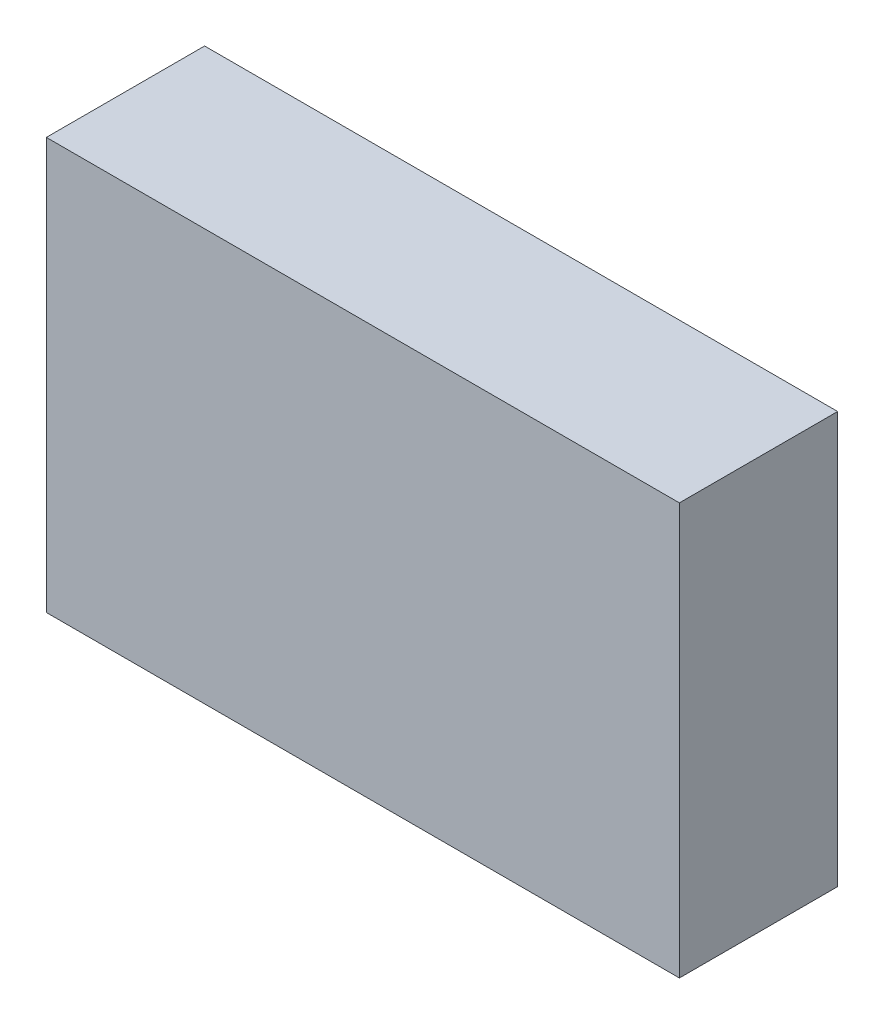
ISO-10303-21;
HEADER;
FILE_DESCRIPTION(('STEP AP214'),'2;1');
FILE_NAME('part.step','',(''),(''),'','','');
FILE_SCHEMA(('AUTOMOTIVE_DESIGN { 1 0 10303 214 1 1 1 1 }'));
ENDSEC;
DATA;
#1=APPLICATION_CONTEXT('core data for automotive mechanical design processes');
#2=APPLICATION_PROTOCOL_DEFINITION('international standard','automotive_design',2000,#1);
#3=PRODUCT_CONTEXT('',#1,'mechanical');
#4=PRODUCT('Part','Part','',(#3));
#5=PRODUCT_RELATED_PRODUCT_CATEGORY('part','',(#4));
#6=PRODUCT_DEFINITION_FORMATION('','',#4);
#7=PRODUCT_DEFINITION_CONTEXT('part definition',#1,'design');
#8=PRODUCT_DEFINITION('design','',#6,#7);
#9=PRODUCT_DEFINITION_SHAPE('','',#8);
#10=(LENGTH_UNIT() NAMED_UNIT(*) SI_UNIT(.MILLI.,.METRE.));
#11=(NAMED_UNIT(*) PLANE_ANGLE_UNIT() SI_UNIT($,.RADIAN.));
#12=(NAMED_UNIT(*) SI_UNIT($,.STERADIAN.) SOLID_ANGLE_UNIT());
#13=UNCERTAINTY_MEASURE_WITH_UNIT(LENGTH_MEASURE(1.E-05),#10,'distance_accuracy_value','');
#14=(GEOMETRIC_REPRESENTATION_CONTEXT(3) GLOBAL_UNCERTAINTY_ASSIGNED_CONTEXT((#13)) GLOBAL_UNIT_ASSIGNED_CONTEXT((#10,
#11,#12)) REPRESENTATION_CONTEXT('',''));
#15=CARTESIAN_POINT('',(0.,0.,0.));
#16=DIRECTION('',(0.,0.,1.));
#17=DIRECTION('',(1.,0.,0.));
#18=AXIS2_PLACEMENT_3D('',#15,#16,#17);
#19=CARTESIAN_POINT('',(-13.,-176.,277.5));
#20=DIRECTION('',(0.,0.,1.));
#21=DIRECTION('',(1.,0.,0.));
#22=AXIS2_PLACEMENT_3D('',#19,#20,#21);
#23=PLANE('',#22);
#24=DIRECTION('',(0.,1.,0.));
#25=VECTOR('',#24,1.);
#26=CARTESIAN_POINT('',(-13.,-176.,277.5));
#27=LINE('',#26,#25);
#28=CARTESIAN_POINT('',(-13.,-176.,277.5));
#29=VERTEX_POINT('',#28);
#30=CARTESIAN_POINT('',(-13.,-111.,277.5));
#31=VERTEX_POINT('',#30);
#32=EDGE_CURVE('E82',#29,#31,#27,.T.);
#33=ORIENTED_EDGE('',*,*,#32,.F.);
#34=DIRECTION('',(1.,0.,0.));
#35=VECTOR('',#34,1.);
#36=CARTESIAN_POINT('',(-13.,-176.,277.5));
#37=LINE('',#36,#35);
#38=CARTESIAN_POINT('',(87.,-176.,277.5));
#39=VERTEX_POINT('',#38);
#40=EDGE_CURVE('E67',#29,#39,#37,.T.);
#41=ORIENTED_EDGE('',*,*,#40,.T.);
#42=DIRECTION('',(0.,1.,0.));
#43=VECTOR('',#42,1.);
#44=CARTESIAN_POINT('',(87.,-176.,277.5));
#45=LINE('',#44,#43);
#46=CARTESIAN_POINT('',(87.,-111.,277.5));
#47=VERTEX_POINT('',#46);
#48=EDGE_CURVE('E76',#39,#47,#45,.T.);
#49=ORIENTED_EDGE('',*,*,#48,.T.);
#50=DIRECTION('',(1.,0.,0.));
#51=VECTOR('',#50,1.);
#52=CARTESIAN_POINT('',(-13.,-111.,277.5));
#53=LINE('',#52,#51);
#54=EDGE_CURVE('E9',#31,#47,#53,.T.);
#55=ORIENTED_EDGE('',*,*,#54,.F.);
#56=EDGE_LOOP('',(#33,#41,#49,#55));
#57=FACE_BOUND('',#56,.T.);
#58=ADVANCED_FACE('F14',(#57),#23,.T.);
#59=CARTESIAN_POINT('',(-13.,-176.,252.5));
#60=DIRECTION('',(0.,0.,1.));
#61=DIRECTION('',(1.,0.,0.));
#62=AXIS2_PLACEMENT_3D('',#59,#60,#61);
#63=PLANE('',#62);
#64=DIRECTION('',(1.,0.,0.));
#65=VECTOR('',#64,1.);
#66=CARTESIAN_POINT('',(-13.,-111.,252.5));
#67=LINE('',#66,#65);
#68=CARTESIAN_POINT('',(-13.,-111.,252.5));
#69=VERTEX_POINT('',#68);
#70=CARTESIAN_POINT('',(87.,-111.,252.5));
#71=VERTEX_POINT('',#70);
#72=EDGE_CURVE('E24',#69,#71,#67,.T.);
#73=ORIENTED_EDGE('',*,*,#72,.T.);
#74=DIRECTION('',(0.,1.,0.));
#75=VECTOR('',#74,1.);
#76=CARTESIAN_POINT('',(87.,-176.,252.5));
#77=LINE('',#76,#75);
#78=CARTESIAN_POINT('',(87.,-176.,252.5));
#79=VERTEX_POINT('',#78);
#80=EDGE_CURVE('E99',#79,#71,#77,.T.);
#81=ORIENTED_EDGE('',*,*,#80,.F.);
#82=DIRECTION('',(1.,0.,0.));
#83=VECTOR('',#82,1.);
#84=CARTESIAN_POINT('',(-13.,-176.,252.5));
#85=LINE('',#84,#83);
#86=CARTESIAN_POINT('',(-13.,-176.,252.5));
#87=VERTEX_POINT('',#86);
#88=EDGE_CURVE('E75',#87,#79,#85,.T.);
#89=ORIENTED_EDGE('',*,*,#88,.F.);
#90=DIRECTION('',(0.,1.,0.));
#91=VECTOR('',#90,1.);
#92=CARTESIAN_POINT('',(-13.,-176.,252.5));
#93=LINE('',#92,#91);
#94=EDGE_CURVE('E84',#87,#69,#93,.T.);
#95=ORIENTED_EDGE('',*,*,#94,.T.);
#96=EDGE_LOOP('',(#73,#81,#89,#95));
#97=FACE_BOUND('',#96,.T.);
#98=ADVANCED_FACE('F111',(#97),#63,.F.);
#99=CARTESIAN_POINT('',(-13.,-111.,252.5));
#100=DIRECTION('',(0.,1.,0.));
#101=DIRECTION('',(1.,0.,0.));
#102=AXIS2_PLACEMENT_3D('',#99,#100,#101);
#103=PLANE('',#102);
#104=ORIENTED_EDGE('',*,*,#72,.F.);
#105=DIRECTION('',(0.,0.,1.));
#106=VECTOR('',#105,1.);
#107=CARTESIAN_POINT('',(-13.,-111.,252.5));
#108=LINE('',#107,#106);
#109=EDGE_CURVE('E87',#69,#31,#108,.T.);
#110=ORIENTED_EDGE('',*,*,#109,.T.);
#111=ORIENTED_EDGE('',*,*,#54,.T.);
#112=DIRECTION('',(0.,0.,1.));
#113=VECTOR('',#112,1.);
#114=CARTESIAN_POINT('',(87.,-111.,252.5));
#115=LINE('',#114,#113);
#116=EDGE_CURVE('E95',#71,#47,#115,.T.);
#117=ORIENTED_EDGE('',*,*,#116,.F.);
#118=EDGE_LOOP('',(#104,#110,#111,#117));
#119=FACE_BOUND('',#118,.T.);
#120=ADVANCED_FACE('F113',(#119),#103,.T.);
#121=CARTESIAN_POINT('',(-13.,-176.,252.5));
#122=DIRECTION('',(0.,1.,0.));
#123=DIRECTION('',(1.,0.,0.));
#124=AXIS2_PLACEMENT_3D('',#121,#122,#123);
#125=PLANE('',#124);
#126=DIRECTION('',(0.,0.,1.));
#127=VECTOR('',#126,1.);
#128=CARTESIAN_POINT('',(87.,-176.,252.5));
#129=LINE('',#128,#127);
#130=EDGE_CURVE('E72',#79,#39,#129,.T.);
#131=ORIENTED_EDGE('',*,*,#130,.T.);
#132=ORIENTED_EDGE('',*,*,#40,.F.);
#133=DIRECTION('',(0.,0.,1.));
#134=VECTOR('',#133,1.);
#135=CARTESIAN_POINT('',(-13.,-176.,252.5));
#136=LINE('',#135,#134);
#137=EDGE_CURVE('E17',#87,#29,#136,.T.);
#138=ORIENTED_EDGE('',*,*,#137,.F.);
#139=ORIENTED_EDGE('',*,*,#88,.T.);
#140=EDGE_LOOP('',(#131,#132,#138,#139));
#141=FACE_BOUND('',#140,.T.);
#142=ADVANCED_FACE('F69',(#141),#125,.F.);
#143=CARTESIAN_POINT('',(87.,-176.,252.5));
#144=DIRECTION('',(1.,0.,0.));
#145=DIRECTION('',(0.,1.,0.));
#146=AXIS2_PLACEMENT_3D('',#143,#144,#145);
#147=PLANE('',#146);
#148=ORIENTED_EDGE('',*,*,#130,.F.);
#149=ORIENTED_EDGE('',*,*,#80,.T.);
#150=ORIENTED_EDGE('',*,*,#116,.T.);
#151=ORIENTED_EDGE('',*,*,#48,.F.);
#152=EDGE_LOOP('',(#148,#149,#150,#151));
#153=FACE_BOUND('',#152,.T.);
#154=ADVANCED_FACE('F115',(#153),#147,.T.);
#155=CARTESIAN_POINT('',(-13.,-176.,252.5));
#156=DIRECTION('',(1.,0.,0.));
#157=DIRECTION('',(0.,1.,0.));
#158=AXIS2_PLACEMENT_3D('',#155,#156,#157);
#159=PLANE('',#158);
#160=ORIENTED_EDGE('',*,*,#32,.T.);
#161=ORIENTED_EDGE('',*,*,#109,.F.);
#162=ORIENTED_EDGE('',*,*,#94,.F.);
#163=ORIENTED_EDGE('',*,*,#137,.T.);
#164=EDGE_LOOP('',(#160,#161,#162,#163));
#165=FACE_BOUND('',#164,.T.);
#166=ADVANCED_FACE('F80',(#165),#159,.F.);
#167=CLOSED_SHELL('',(#58,#98,#120,#142,#154,#166));
#168=MANIFOLD_SOLID_BREP('B1',#167);
#169=ADVANCED_BREP_SHAPE_REPRESENTATION('',(#18,#168),#14);
#170=SHAPE_DEFINITION_REPRESENTATION(#9,#169);
ENDSEC;
END-ISO-10303-21;
